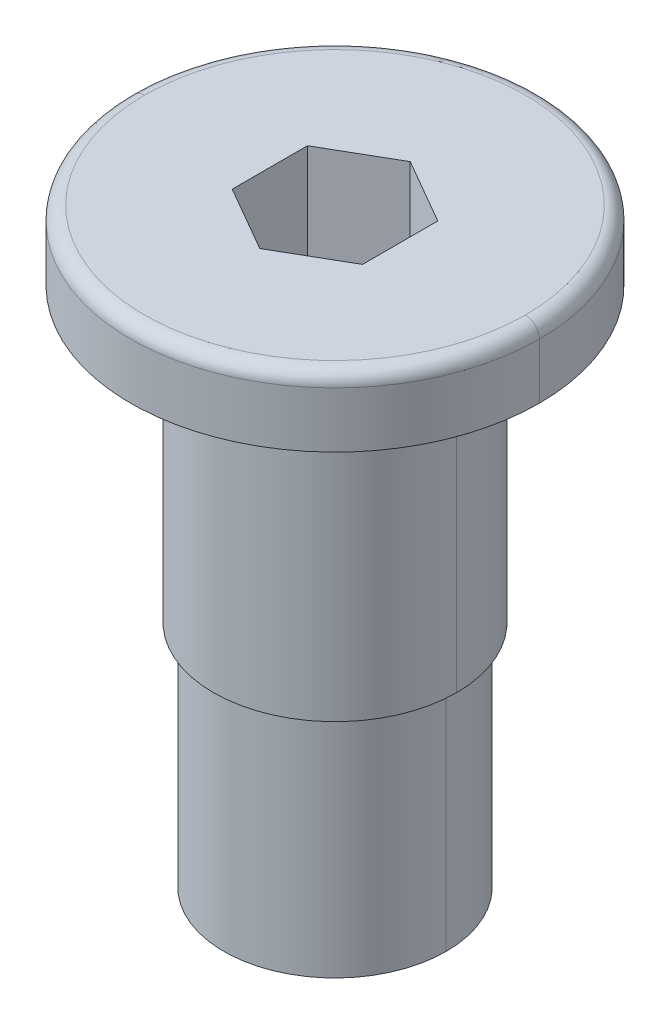
ISO-10303-21;
HEADER;
FILE_DESCRIPTION(('STEP AP214'),'2;1');
FILE_NAME('part.step','',(''),(''),'','','');
FILE_SCHEMA(('AUTOMOTIVE_DESIGN { 1 0 10303 214 1 1 1 1 }'));
ENDSEC;
DATA;
#1=APPLICATION_CONTEXT('core data for automotive mechanical design processes');
#2=APPLICATION_PROTOCOL_DEFINITION('international standard','automotive_design',2000,#1);
#3=PRODUCT_CONTEXT('',#1,'mechanical');
#4=PRODUCT('Part','Part','',(#3));
#5=PRODUCT_RELATED_PRODUCT_CATEGORY('part','',(#4));
#6=PRODUCT_DEFINITION_FORMATION('','',#4);
#7=PRODUCT_DEFINITION_CONTEXT('part definition',#1,'design');
#8=PRODUCT_DEFINITION('design','',#6,#7);
#9=PRODUCT_DEFINITION_SHAPE('','',#8);
#10=(LENGTH_UNIT() NAMED_UNIT(*) SI_UNIT(.MILLI.,.METRE.));
#11=(NAMED_UNIT(*) PLANE_ANGLE_UNIT() SI_UNIT($,.RADIAN.));
#12=(NAMED_UNIT(*) SI_UNIT($,.STERADIAN.) SOLID_ANGLE_UNIT());
#13=UNCERTAINTY_MEASURE_WITH_UNIT(LENGTH_MEASURE(1.E-05),#10,'distance_accuracy_value','');
#14=(GEOMETRIC_REPRESENTATION_CONTEXT(3) GLOBAL_UNCERTAINTY_ASSIGNED_CONTEXT((#13)) GLOBAL_UNIT_ASSIGNED_CONTEXT((#10,
#11,#12)) REPRESENTATION_CONTEXT('',''));
#15=CARTESIAN_POINT('',(0.,0.,0.));
#16=DIRECTION('',(0.,0.,1.));
#17=DIRECTION('',(1.,0.,0.));
#18=AXIS2_PLACEMENT_3D('',#15,#16,#17);
#19=CARTESIAN_POINT('',(0.,1.016,0.));
#20=DIRECTION('',(0.,1.,0.));
#21=DIRECTION('',(-1.,0.,0.));
#22=AXIS2_PLACEMENT_3D('',#19,#20,#21);
#23=TOROIDAL_SURFACE('',#22,3.4798,0.254);
#24=CARTESIAN_POINT('',(0.,1.016,0.));
#25=DIRECTION('',(0.,-1.,0.));
#26=DIRECTION('',(-1.,0.,0.));
#27=AXIS2_PLACEMENT_3D('',#24,#25,#26);
#28=CIRCLE('',#27,3.7338);
#29=CARTESIAN_POINT('',(3.7338,1.016,0.));
#30=VERTEX_POINT('',#29);
#31=CARTESIAN_POINT('',(-3.7338,1.016,0.));
#32=VERTEX_POINT('',#31);
#33=EDGE_CURVE('E242',#30,#32,#28,.T.);
#34=ORIENTED_EDGE('',*,*,#33,.F.);
#35=CARTESIAN_POINT('',(3.4798,1.016,0.));
#36=DIRECTION('',(0.,0.,1.));
#37=DIRECTION('',(1.,0.,0.));
#38=AXIS2_PLACEMENT_3D('',#35,#36,#37);
#39=CIRCLE('',#38,0.254);
#40=CARTESIAN_POINT('',(3.4798,1.27,0.));
#41=VERTEX_POINT('',#40);
#42=EDGE_CURVE('E9',#30,#41,#39,.T.);
#43=ORIENTED_EDGE('',*,*,#42,.T.);
#44=CARTESIAN_POINT('',(0.,1.27,0.));
#45=DIRECTION('',(0.,1.,0.));
#46=DIRECTION('',(-1.,0.,0.));
#47=AXIS2_PLACEMENT_3D('',#44,#45,#46);
#48=CIRCLE('',#47,3.4798);
#49=CARTESIAN_POINT('',(-3.4798,1.27,0.));
#50=VERTEX_POINT('',#49);
#51=EDGE_CURVE('E211',#50,#41,#48,.T.);
#52=ORIENTED_EDGE('',*,*,#51,.F.);
#53=CARTESIAN_POINT('',(-3.4798,1.016,0.));
#54=DIRECTION('',(0.,0.,-1.));
#55=DIRECTION('',(-1.,0.,0.));
#56=AXIS2_PLACEMENT_3D('',#53,#54,#55);
#57=CIRCLE('',#56,0.254);
#58=EDGE_CURVE('E204',#32,#50,#57,.T.);
#59=ORIENTED_EDGE('',*,*,#58,.F.);
#60=EDGE_LOOP('',(#34,#43,#52,#59));
#61=FACE_BOUND('',#60,.T.);
#62=ADVANCED_FACE('F15',(#61),#23,.T.);
#63=CARTESIAN_POINT('',(0.,-9.525,0.));
#64=DIRECTION('',(0.,-1.,0.));
#65=DIRECTION('',(1.,0.,0.));
#66=AXIS2_PLACEMENT_3D('',#63,#64,#65);
#67=CYLINDRICAL_SURFACE('',#66,2.032);
#68=CARTESIAN_POINT('',(0.,-5.334,0.));
#69=DIRECTION('',(0.,-1.,0.));
#70=DIRECTION('',(1.,0.,0.));
#71=AXIS2_PLACEMENT_3D('',#68,#69,#70);
#72=CIRCLE('',#71,2.032);
#73=CARTESIAN_POINT('',(2.032,-5.334,0.));
#74=VERTEX_POINT('',#73);
#75=CARTESIAN_POINT('',(-2.032,-5.334,0.));
#76=VERTEX_POINT('',#75);
#77=EDGE_CURVE('E26',#74,#76,#72,.T.);
#78=ORIENTED_EDGE('',*,*,#77,.T.);
#79=DIRECTION('',(0.,-1.,0.));
#80=VECTOR('',#79,1.);
#81=CARTESIAN_POINT('',(-2.032,-9.525,0.));
#82=LINE('',#81,#80);
#83=CARTESIAN_POINT('',(-2.032,-9.525,0.));
#84=VERTEX_POINT('',#83);
#85=EDGE_CURVE('E202',#76,#84,#82,.T.);
#86=ORIENTED_EDGE('',*,*,#85,.T.);
#87=CARTESIAN_POINT('',(0.,-9.525,0.));
#88=DIRECTION('',(0.,-1.,0.));
#89=DIRECTION('',(1.,0.,0.));
#90=AXIS2_PLACEMENT_3D('',#87,#88,#89);
#91=CIRCLE('',#90,2.032);
#92=CARTESIAN_POINT('',(2.032,-9.525,0.));
#93=VERTEX_POINT('',#92);
#94=EDGE_CURVE('E191',#93,#84,#91,.T.);
#95=ORIENTED_EDGE('',*,*,#94,.F.);
#96=DIRECTION('',(0.,-1.,0.));
#97=VECTOR('',#96,1.);
#98=CARTESIAN_POINT('',(2.032,-9.525,0.));
#99=LINE('',#98,#97);
#100=EDGE_CURVE('E186',#74,#93,#99,.T.);
#101=ORIENTED_EDGE('',*,*,#100,.F.);
#102=EDGE_LOOP('',(#78,#86,#95,#101));
#103=FACE_BOUND('',#102,.T.);
#104=ADVANCED_FACE('F287',(#103),#67,.T.);
#105=CARTESIAN_POINT('',(0.,-9.525,0.));
#106=DIRECTION('',(0.,-1.,0.));
#107=DIRECTION('',(1.,0.,0.));
#108=AXIS2_PLACEMENT_3D('',#105,#106,#107);
#109=CYLINDRICAL_SURFACE('',#108,2.2225);
#110=CARTESIAN_POINT('',(0.,0.,0.));
#111=DIRECTION('',(0.,-1.,0.));
#112=DIRECTION('',(1.,0.,0.));
#113=AXIS2_PLACEMENT_3D('',#110,#111,#112);
#114=CIRCLE('',#113,2.2225);
#115=CARTESIAN_POINT('',(2.2225,0.,0.));
#116=VERTEX_POINT('',#115);
#117=CARTESIAN_POINT('',(-2.22249999999997,0.,0.));
#118=VERTEX_POINT('',#117);
#119=EDGE_CURVE('E198',#116,#118,#114,.T.);
#120=ORIENTED_EDGE('',*,*,#119,.T.);
#121=DIRECTION('',(0.,-1.,0.));
#122=VECTOR('',#121,1.);
#123=CARTESIAN_POINT('',(-2.2225,-9.525,0.));
#124=LINE('',#123,#122);
#125=CARTESIAN_POINT('',(-2.2225,-5.334,0.));
#126=VERTEX_POINT('',#125);
#127=EDGE_CURVE('E203',#118,#126,#124,.T.);
#128=ORIENTED_EDGE('',*,*,#127,.T.);
#129=CARTESIAN_POINT('',(0.,-5.334,0.));
#130=DIRECTION('',(0.,-1.,0.));
#131=DIRECTION('',(1.,0.,0.));
#132=AXIS2_PLACEMENT_3D('',#129,#130,#131);
#133=CIRCLE('',#132,2.2225);
#134=CARTESIAN_POINT('',(2.2225,-5.334,0.));
#135=VERTEX_POINT('',#134);
#136=EDGE_CURVE('E233',#135,#126,#133,.T.);
#137=ORIENTED_EDGE('',*,*,#136,.F.);
#138=DIRECTION('',(0.,-1.,0.));
#139=VECTOR('',#138,1.);
#140=CARTESIAN_POINT('',(2.2225,-9.525,0.));
#141=LINE('',#140,#139);
#142=EDGE_CURVE('E229',#116,#135,#141,.T.);
#143=ORIENTED_EDGE('',*,*,#142,.F.);
#144=EDGE_LOOP('',(#120,#128,#137,#143));
#145=FACE_BOUND('',#144,.T.);
#146=ADVANCED_FACE('F481',(#145),#109,.T.);
#147=CARTESIAN_POINT('',(0.,-9.525,0.));
#148=DIRECTION('',(0.,-1.,0.));
#149=DIRECTION('',(1.,0.,0.));
#150=AXIS2_PLACEMENT_3D('',#147,#148,#149);
#151=CYLINDRICAL_SURFACE('',#150,3.7338);
#152=ORIENTED_EDGE('',*,*,#33,.T.);
#153=DIRECTION('',(0.,-1.,0.));
#154=VECTOR('',#153,1.);
#155=CARTESIAN_POINT('',(-3.7338,-9.525,0.));
#156=LINE('',#155,#154);
#157=CARTESIAN_POINT('',(-3.7338,0.,0.));
#158=VERTEX_POINT('',#157);
#159=EDGE_CURVE('E178',#32,#158,#156,.T.);
#160=ORIENTED_EDGE('',*,*,#159,.T.);
#161=CARTESIAN_POINT('',(0.,0.,0.));
#162=DIRECTION('',(0.,-1.,0.));
#163=DIRECTION('',(1.,0.,0.));
#164=AXIS2_PLACEMENT_3D('',#161,#162,#163);
#165=CIRCLE('',#164,3.7338);
#166=CARTESIAN_POINT('',(3.7338,0.,0.));
#167=VERTEX_POINT('',#166);
#168=EDGE_CURVE('E196',#167,#158,#165,.T.);
#169=ORIENTED_EDGE('',*,*,#168,.F.);
#170=DIRECTION('',(0.,-1.,0.));
#171=VECTOR('',#170,1.);
#172=CARTESIAN_POINT('',(3.7338,-9.525,0.));
#173=LINE('',#172,#171);
#174=EDGE_CURVE('E41',#30,#167,#173,.T.);
#175=ORIENTED_EDGE('',*,*,#174,.F.);
#176=EDGE_LOOP('',(#152,#160,#169,#175));
#177=FACE_BOUND('',#176,.T.);
#178=ADVANCED_FACE('F578',(#177),#151,.T.);
#179=CARTESIAN_POINT('',(0.,1.27,0.));
#180=DIRECTION('',(0.,1.,0.));
#181=DIRECTION('',(1.,0.,0.));
#182=AXIS2_PLACEMENT_3D('',#179,#180,#181);
#183=PLANE('',#182);
#184=ORIENTED_EDGE('',*,*,#51,.T.);
#185=CARTESIAN_POINT('',(0.,1.27,0.));
#186=DIRECTION('',(0.,1.,0.));
#187=DIRECTION('',(-1.,0.,0.));
#188=AXIS2_PLACEMENT_3D('',#185,#186,#187);
#189=CIRCLE('',#188,3.4798);
#190=EDGE_CURVE('E207',#41,#50,#189,.T.);
#191=ORIENTED_EDGE('',*,*,#190,.T.);
#192=EDGE_LOOP('',(#184,#191));
#193=FACE_BOUND('',#192,.T.);
#194=DIRECTION('',(-0.866025403784439,0.,-0.5));
#195=VECTOR('',#194,1.);
#196=CARTESIAN_POINT('',(1.190625,1.27,-0.687407664253898));
#197=LINE('',#196,#195);
#198=CARTESIAN_POINT('',(1.190625,1.27,-0.687407664253898));
#199=VERTEX_POINT('',#198);
#200=CARTESIAN_POINT('',(0.,1.27,-1.3748153285078));
#201=VERTEX_POINT('',#200);
#202=EDGE_CURVE('E259',#199,#201,#197,.T.);
#203=ORIENTED_EDGE('',*,*,#202,.F.);
#204=DIRECTION('',(0.,0.,-1.));
#205=VECTOR('',#204,1.);
#206=CARTESIAN_POINT('',(1.190625,1.27,0.687407664253899));
#207=LINE('',#206,#205);
#208=CARTESIAN_POINT('',(1.190625,1.27,0.687407664253899));
#209=VERTEX_POINT('',#208);
#210=EDGE_CURVE('E213',#209,#199,#207,.T.);
#211=ORIENTED_EDGE('',*,*,#210,.F.);
#212=DIRECTION('',(0.866025403784439,0.,-0.5));
#213=VECTOR('',#212,1.);
#214=CARTESIAN_POINT('',(0.,1.27,1.3748153285078));
#215=LINE('',#214,#213);
#216=CARTESIAN_POINT('',(0.,1.27,1.3748153285078));
#217=VERTEX_POINT('',#216);
#218=EDGE_CURVE('E185',#217,#209,#215,.T.);
#219=ORIENTED_EDGE('',*,*,#218,.F.);
#220=DIRECTION('',(0.866025403784439,0.,0.5));
#221=VECTOR('',#220,1.);
#222=CARTESIAN_POINT('',(-1.190625,1.27,0.687407664253898));
#223=LINE('',#222,#221);
#224=CARTESIAN_POINT('',(-1.190625,1.27,0.687407664253898));
#225=VERTEX_POINT('',#224);
#226=EDGE_CURVE('E162',#225,#217,#223,.T.);
#227=ORIENTED_EDGE('',*,*,#226,.F.);
#228=DIRECTION('',(0.,0.,1.));
#229=VECTOR('',#228,1.);
#230=CARTESIAN_POINT('',(-1.190625,1.27,-0.687407664253899));
#231=LINE('',#230,#229);
#232=CARTESIAN_POINT('',(-1.190625,1.27,-0.687407664253899));
#233=VERTEX_POINT('',#232);
#234=EDGE_CURVE('E159',#233,#225,#231,.T.);
#235=ORIENTED_EDGE('',*,*,#234,.F.);
#236=DIRECTION('',(-0.866025403784439,0.,0.5));
#237=VECTOR('',#236,1.);
#238=CARTESIAN_POINT('',(0.,1.27,-1.3748153285078));
#239=LINE('',#238,#237);
#240=EDGE_CURVE('E239',#201,#233,#239,.T.);
#241=ORIENTED_EDGE('',*,*,#240,.F.);
#242=EDGE_LOOP('',(#203,#211,#219,#227,#235,#241));
#243=FACE_BOUND('',#242,.T.);
#244=ADVANCED_FACE('F315',(#193,#243),#183,.T.);
#245=CARTESIAN_POINT('',(0.,-9.525,0.));
#246=DIRECTION('',(0.,-1.,0.));
#247=DIRECTION('',(1.,0.,0.));
#248=AXIS2_PLACEMENT_3D('',#245,#246,#247);
#249=CYLINDRICAL_SURFACE('',#248,3.7338);
#250=ORIENTED_EDGE('',*,*,#159,.F.);
#251=CARTESIAN_POINT('',(0.,1.016,0.));
#252=DIRECTION('',(0.,-1.,0.));
#253=DIRECTION('',(-1.,0.,0.));
#254=AXIS2_PLACEMENT_3D('',#251,#252,#253);
#255=CIRCLE('',#254,3.7338);
#256=EDGE_CURVE('E212',#32,#30,#255,.T.);
#257=ORIENTED_EDGE('',*,*,#256,.T.);
#258=ORIENTED_EDGE('',*,*,#174,.T.);
#259=CARTESIAN_POINT('',(0.,0.,0.));
#260=DIRECTION('',(0.,-1.,0.));
#261=DIRECTION('',(1.,0.,0.));
#262=AXIS2_PLACEMENT_3D('',#259,#260,#261);
#263=CIRCLE('',#262,3.7338);
#264=EDGE_CURVE('E192',#158,#167,#263,.T.);
#265=ORIENTED_EDGE('',*,*,#264,.F.);
#266=EDGE_LOOP('',(#250,#257,#258,#265));
#267=FACE_BOUND('',#266,.T.);
#268=ADVANCED_FACE('F530',(#267),#249,.T.);
#269=CARTESIAN_POINT('',(3.7338,0.,0.));
#270=DIRECTION('',(0.,-1.,0.));
#271=DIRECTION('',(-1.,0.,0.));
#272=AXIS2_PLACEMENT_3D('',#269,#270,#271);
#273=PLANE('',#272);
#274=ORIENTED_EDGE('',*,*,#168,.T.);
#275=ORIENTED_EDGE('',*,*,#264,.T.);
#276=EDGE_LOOP('',(#274,#275));
#277=FACE_BOUND('',#276,.T.);
#278=ORIENTED_EDGE('',*,*,#119,.F.);
#279=CARTESIAN_POINT('',(0.,0.,0.));
#280=DIRECTION('',(0.,-1.,0.));
#281=DIRECTION('',(1.,0.,0.));
#282=AXIS2_PLACEMENT_3D('',#279,#280,#281);
#283=CIRCLE('',#282,2.2225);
#284=EDGE_CURVE('E197',#118,#116,#283,.T.);
#285=ORIENTED_EDGE('',*,*,#284,.F.);
#286=EDGE_LOOP('',(#278,#285));
#287=FACE_BOUND('',#286,.T.);
#288=ADVANCED_FACE('F511',(#277,#287),#273,.T.);
#289=CARTESIAN_POINT('',(0.,-9.525,0.));
#290=DIRECTION('',(0.,-1.,0.));
#291=DIRECTION('',(1.,0.,0.));
#292=AXIS2_PLACEMENT_3D('',#289,#290,#291);
#293=CYLINDRICAL_SURFACE('',#292,2.2225);
#294=ORIENTED_EDGE('',*,*,#127,.F.);
#295=ORIENTED_EDGE('',*,*,#284,.T.);
#296=ORIENTED_EDGE('',*,*,#142,.T.);
#297=CARTESIAN_POINT('',(0.,-5.334,0.));
#298=DIRECTION('',(0.,-1.,0.));
#299=DIRECTION('',(1.,0.,0.));
#300=AXIS2_PLACEMENT_3D('',#297,#298,#299);
#301=CIRCLE('',#300,2.2225);
#302=EDGE_CURVE('E252',#126,#135,#301,.T.);
#303=ORIENTED_EDGE('',*,*,#302,.F.);
#304=EDGE_LOOP('',(#294,#295,#296,#303));
#305=FACE_BOUND('',#304,.T.);
#306=ADVANCED_FACE('F507',(#305),#293,.T.);
#307=CARTESIAN_POINT('',(2.2225,-5.334,0.));
#308=DIRECTION('',(0.,-1.,0.));
#309=DIRECTION('',(-1.,0.,0.));
#310=AXIS2_PLACEMENT_3D('',#307,#308,#309);
#311=PLANE('',#310);
#312=ORIENTED_EDGE('',*,*,#136,.T.);
#313=ORIENTED_EDGE('',*,*,#302,.T.);
#314=EDGE_LOOP('',(#312,#313));
#315=FACE_BOUND('',#314,.T.);
#316=ORIENTED_EDGE('',*,*,#77,.F.);
#317=CARTESIAN_POINT('',(0.,-5.334,0.));
#318=DIRECTION('',(0.,-1.,0.));
#319=DIRECTION('',(1.,0.,0.));
#320=AXIS2_PLACEMENT_3D('',#317,#318,#319);
#321=CIRCLE('',#320,2.032);
#322=EDGE_CURVE('E190',#76,#74,#321,.T.);
#323=ORIENTED_EDGE('',*,*,#322,.F.);
#324=EDGE_LOOP('',(#316,#323));
#325=FACE_BOUND('',#324,.T.);
#326=ADVANCED_FACE('F289',(#315,#325),#311,.T.);
#327=CARTESIAN_POINT('',(0.,-9.525,0.));
#328=DIRECTION('',(0.,-1.,0.));
#329=DIRECTION('',(1.,0.,0.));
#330=AXIS2_PLACEMENT_3D('',#327,#328,#329);
#331=CYLINDRICAL_SURFACE('',#330,2.032);
#332=ORIENTED_EDGE('',*,*,#85,.F.);
#333=ORIENTED_EDGE('',*,*,#322,.T.);
#334=ORIENTED_EDGE('',*,*,#100,.T.);
#335=CARTESIAN_POINT('',(0.,-9.525,0.));
#336=DIRECTION('',(0.,-1.,0.));
#337=DIRECTION('',(1.,0.,0.));
#338=AXIS2_PLACEMENT_3D('',#335,#336,#337);
#339=CIRCLE('',#338,2.032);
#340=EDGE_CURVE('E263',#84,#93,#339,.T.);
#341=ORIENTED_EDGE('',*,*,#340,.F.);
#342=EDGE_LOOP('',(#332,#333,#334,#341));
#343=FACE_BOUND('',#342,.T.);
#344=ADVANCED_FACE('F282',(#343),#331,.T.);
#345=CARTESIAN_POINT('',(2.032,-9.525,0.));
#346=DIRECTION('',(0.,-1.,0.));
#347=DIRECTION('',(-1.,0.,0.));
#348=AXIS2_PLACEMENT_3D('',#345,#346,#347);
#349=PLANE('',#348);
#350=ORIENTED_EDGE('',*,*,#94,.T.);
#351=ORIENTED_EDGE('',*,*,#340,.T.);
#352=EDGE_LOOP('',(#350,#351));
#353=FACE_BOUND('',#352,.T.);
#354=ADVANCED_FACE('F280',(#353),#349,.T.);
#355=CARTESIAN_POINT('',(1.190625,-1.27,-0.687407664253898));
#356=DIRECTION('',(0.5,0.,-0.866025403784439));
#357=DIRECTION('',(0.,-1.,0.));
#358=AXIS2_PLACEMENT_3D('',#355,#356,#357);
#359=PLANE('',#358);
#360=ORIENTED_EDGE('',*,*,#202,.T.);
#361=DIRECTION('',(0.,1.,0.));
#362=VECTOR('',#361,1.);
#363=CARTESIAN_POINT('',(0.,-1.27,-1.3748153285078));
#364=LINE('',#363,#362);
#365=CARTESIAN_POINT('',(0.,-1.27,-1.3748153285078));
#366=VERTEX_POINT('',#365);
#367=EDGE_CURVE('E235',#366,#201,#364,.T.);
#368=ORIENTED_EDGE('',*,*,#367,.F.);
#369=DIRECTION('',(-0.866025403784439,0.,-0.5));
#370=VECTOR('',#369,1.);
#371=CARTESIAN_POINT('',(1.190625,-1.27,-0.687407664253898));
#372=LINE('',#371,#370);
#373=CARTESIAN_POINT('',(1.190625,-1.27,-0.687407664253898));
#374=VERTEX_POINT('',#373);
#375=EDGE_CURVE('E174',#374,#366,#372,.T.);
#376=ORIENTED_EDGE('',*,*,#375,.F.);
#377=DIRECTION('',(0.,1.,0.));
#378=VECTOR('',#377,1.);
#379=CARTESIAN_POINT('',(1.190625,-1.27,-0.687407664253898));
#380=LINE('',#379,#378);
#381=EDGE_CURVE('E19',#374,#199,#380,.T.);
#382=ORIENTED_EDGE('',*,*,#381,.T.);
#383=EDGE_LOOP('',(#360,#368,#376,#382));
#384=FACE_BOUND('',#383,.T.);
#385=ADVANCED_FACE('F317',(#384),#359,.F.);
#386=CARTESIAN_POINT('',(1.190625,-1.27,0.687407664253899));
#387=DIRECTION('',(1.,0.,0.));
#388=DIRECTION('',(0.,0.,1.));
#389=AXIS2_PLACEMENT_3D('',#386,#387,#388);
#390=PLANE('',#389);
#391=ORIENTED_EDGE('',*,*,#210,.T.);
#392=ORIENTED_EDGE('',*,*,#381,.F.);
#393=DIRECTION('',(0.,0.,-1.));
#394=VECTOR('',#393,1.);
#395=CARTESIAN_POINT('',(1.190625,-1.27,0.687407664253899));
#396=LINE('',#395,#394);
#397=CARTESIAN_POINT('',(1.190625,-1.27,0.687407664253899));
#398=VERTEX_POINT('',#397);
#399=EDGE_CURVE('E182',#398,#374,#396,.T.);
#400=ORIENTED_EDGE('',*,*,#399,.F.);
#401=DIRECTION('',(0.,1.,0.));
#402=VECTOR('',#401,1.);
#403=CARTESIAN_POINT('',(1.190625,-1.27,0.687407664253899));
#404=LINE('',#403,#402);
#405=EDGE_CURVE('E216',#398,#209,#404,.T.);
#406=ORIENTED_EDGE('',*,*,#405,.T.);
#407=EDGE_LOOP('',(#391,#392,#400,#406));
#408=FACE_BOUND('',#407,.T.);
#409=ADVANCED_FACE('F17',(#408),#390,.F.);
#410=CARTESIAN_POINT('',(0.,-1.27,1.3748153285078));
#411=DIRECTION('',(0.5,0.,0.866025403784439));
#412=DIRECTION('',(0.,-1.,0.));
#413=AXIS2_PLACEMENT_3D('',#410,#411,#412);
#414=PLANE('',#413);
#415=ORIENTED_EDGE('',*,*,#218,.T.);
#416=ORIENTED_EDGE('',*,*,#405,.F.);
#417=DIRECTION('',(0.866025403784439,0.,-0.5));
#418=VECTOR('',#417,1.);
#419=CARTESIAN_POINT('',(0.,-1.27,1.3748153285078));
#420=LINE('',#419,#418);
#421=CARTESIAN_POINT('',(0.,-1.27,1.3748153285078));
#422=VERTEX_POINT('',#421);
#423=EDGE_CURVE('E154',#422,#398,#420,.T.);
#424=ORIENTED_EDGE('',*,*,#423,.F.);
#425=DIRECTION('',(0.,1.,0.));
#426=VECTOR('',#425,1.);
#427=CARTESIAN_POINT('',(0.,-1.27,1.3748153285078));
#428=LINE('',#427,#426);
#429=EDGE_CURVE('E150',#422,#217,#428,.T.);
#430=ORIENTED_EDGE('',*,*,#429,.T.);
#431=EDGE_LOOP('',(#415,#416,#424,#430));
#432=FACE_BOUND('',#431,.T.);
#433=ADVANCED_FACE('F310',(#432),#414,.F.);
#434=CARTESIAN_POINT('',(-1.190625,-1.27,0.687407664253898));
#435=DIRECTION('',(-0.5,0.,0.866025403784439));
#436=DIRECTION('',(0.,1.,0.));
#437=AXIS2_PLACEMENT_3D('',#434,#435,#436);
#438=PLANE('',#437);
#439=ORIENTED_EDGE('',*,*,#226,.T.);
#440=ORIENTED_EDGE('',*,*,#429,.F.);
#441=DIRECTION('',(0.866025403784439,0.,0.5));
#442=VECTOR('',#441,1.);
#443=CARTESIAN_POINT('',(-1.190625,-1.27,0.687407664253898));
#444=LINE('',#443,#442);
#445=CARTESIAN_POINT('',(-1.190625,-1.27,0.687407664253898));
#446=VERTEX_POINT('',#445);
#447=EDGE_CURVE('E146',#446,#422,#444,.T.);
#448=ORIENTED_EDGE('',*,*,#447,.F.);
#449=DIRECTION('',(0.,1.,0.));
#450=VECTOR('',#449,1.);
#451=CARTESIAN_POINT('',(-1.190625,-1.27,0.687407664253898));
#452=LINE('',#451,#450);
#453=EDGE_CURVE('E148',#446,#225,#452,.T.);
#454=ORIENTED_EDGE('',*,*,#453,.T.);
#455=EDGE_LOOP('',(#439,#440,#448,#454));
#456=FACE_BOUND('',#455,.T.);
#457=ADVANCED_FACE('F147',(#456),#438,.F.);
#458=CARTESIAN_POINT('',(-1.190625,-1.27,-0.687407664253899));
#459=DIRECTION('',(-1.,0.,0.));
#460=DIRECTION('',(0.,0.,1.));
#461=AXIS2_PLACEMENT_3D('',#458,#459,#460);
#462=PLANE('',#461);
#463=ORIENTED_EDGE('',*,*,#234,.T.);
#464=ORIENTED_EDGE('',*,*,#453,.F.);
#465=DIRECTION('',(0.,0.,1.));
#466=VECTOR('',#465,1.);
#467=CARTESIAN_POINT('',(-1.190625,-1.27,-0.687407664253899));
#468=LINE('',#467,#466);
#469=CARTESIAN_POINT('',(-1.190625,-1.27,-0.687407664253899));
#470=VERTEX_POINT('',#469);
#471=EDGE_CURVE('E136',#470,#446,#468,.T.);
#472=ORIENTED_EDGE('',*,*,#471,.F.);
#473=DIRECTION('',(0.,1.,0.));
#474=VECTOR('',#473,1.);
#475=CARTESIAN_POINT('',(-1.190625,-1.27,-0.687407664253899));
#476=LINE('',#475,#474);
#477=EDGE_CURVE('E224',#470,#233,#476,.T.);
#478=ORIENTED_EDGE('',*,*,#477,.T.);
#479=EDGE_LOOP('',(#463,#464,#472,#478));
#480=FACE_BOUND('',#479,.T.);
#481=ADVANCED_FACE('F157',(#480),#462,.F.);
#482=CARTESIAN_POINT('',(0.,-1.27,-1.3748153285078));
#483=DIRECTION('',(-0.5,0.,-0.866025403784439));
#484=DIRECTION('',(-0.866025403784439,0.,0.5));
#485=AXIS2_PLACEMENT_3D('',#482,#483,#484);
#486=PLANE('',#485);
#487=ORIENTED_EDGE('',*,*,#240,.T.);
#488=ORIENTED_EDGE('',*,*,#477,.F.);
#489=DIRECTION('',(-0.866025403784439,0.,0.5));
#490=VECTOR('',#489,1.);
#491=CARTESIAN_POINT('',(0.,-1.27,-1.3748153285078));
#492=LINE('',#491,#490);
#493=EDGE_CURVE('E167',#366,#470,#492,.T.);
#494=ORIENTED_EDGE('',*,*,#493,.F.);
#495=ORIENTED_EDGE('',*,*,#367,.T.);
#496=EDGE_LOOP('',(#487,#488,#494,#495));
#497=FACE_BOUND('',#496,.T.);
#498=ADVANCED_FACE('F500',(#497),#486,.F.);
#499=CARTESIAN_POINT('',(0.,-1.27,-1.3748153285078));
#500=DIRECTION('',(0.,1.,0.));
#501=DIRECTION('',(1.,0.,0.));
#502=AXIS2_PLACEMENT_3D('',#499,#500,#501);
#503=PLANE('',#502);
#504=ORIENTED_EDGE('',*,*,#375,.T.);
#505=ORIENTED_EDGE('',*,*,#493,.T.);
#506=ORIENTED_EDGE('',*,*,#471,.T.);
#507=ORIENTED_EDGE('',*,*,#447,.T.);
#508=ORIENTED_EDGE('',*,*,#423,.T.);
#509=ORIENTED_EDGE('',*,*,#399,.T.);
#510=EDGE_LOOP('',(#504,#505,#506,#507,#508,#509));
#511=FACE_BOUND('',#510,.T.);
#512=ADVANCED_FACE('F165',(#511),#503,.T.);
#513=CARTESIAN_POINT('',(0.,1.016,0.));
#514=DIRECTION('',(0.,1.,0.));
#515=DIRECTION('',(-1.,0.,0.));
#516=AXIS2_PLACEMENT_3D('',#513,#514,#515);
#517=TOROIDAL_SURFACE('',#516,3.4798,0.254);
#518=ORIENTED_EDGE('',*,*,#42,.F.);
#519=ORIENTED_EDGE('',*,*,#256,.F.);
#520=ORIENTED_EDGE('',*,*,#58,.T.);
#521=ORIENTED_EDGE('',*,*,#190,.F.);
#522=EDGE_LOOP('',(#518,#519,#520,#521));
#523=FACE_BOUND('',#522,.T.);
#524=ADVANCED_FACE('F519',(#523),#517,.T.);
#525=CLOSED_SHELL('',(#62,#104,#146,#178,#244,#268,#288,#306,#326,#344,#354,#385,#409,#433,#457,
#481,#498,#512,#524));
#526=MANIFOLD_SOLID_BREP('B1',#525);
#527=ADVANCED_BREP_SHAPE_REPRESENTATION('',(#18,#526),#14);
#528=SHAPE_DEFINITION_REPRESENTATION(#9,#527);
ENDSEC;
END-ISO-10303-21;
